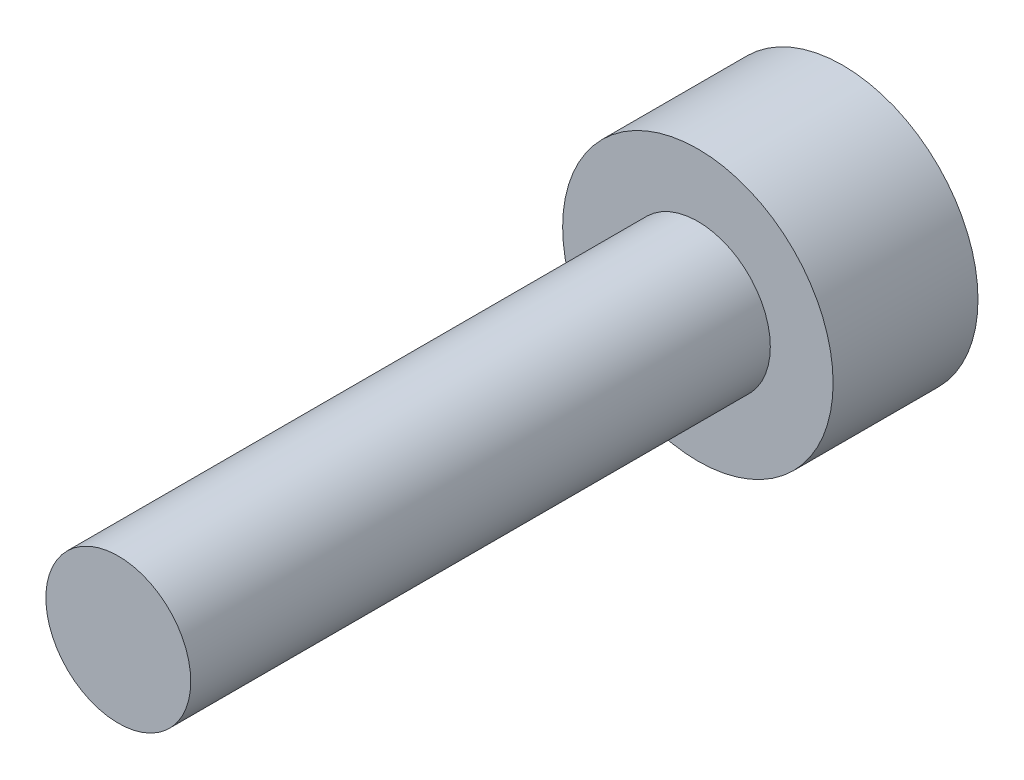
ISO-10303-21;
HEADER;
FILE_DESCRIPTION(('STEP AP214'),'2;1');
FILE_NAME('part.step','',(''),(''),'','','');
FILE_SCHEMA(('AUTOMOTIVE_DESIGN { 1 0 10303 214 1 1 1 1 }'));
ENDSEC;
DATA;
#1=APPLICATION_CONTEXT('core data for automotive mechanical design processes');
#2=APPLICATION_PROTOCOL_DEFINITION('international standard','automotive_design',2000,#1);
#3=PRODUCT_CONTEXT('',#1,'mechanical');
#4=PRODUCT('Part','Part','',(#3));
#5=PRODUCT_RELATED_PRODUCT_CATEGORY('part','',(#4));
#6=PRODUCT_DEFINITION_FORMATION('','',#4);
#7=PRODUCT_DEFINITION_CONTEXT('part definition',#1,'design');
#8=PRODUCT_DEFINITION('design','',#6,#7);
#9=PRODUCT_DEFINITION_SHAPE('','',#8);
#10=(LENGTH_UNIT() NAMED_UNIT(*) SI_UNIT(.MILLI.,.METRE.));
#11=(NAMED_UNIT(*) PLANE_ANGLE_UNIT() SI_UNIT($,.RADIAN.));
#12=(NAMED_UNIT(*) SI_UNIT($,.STERADIAN.) SOLID_ANGLE_UNIT());
#13=UNCERTAINTY_MEASURE_WITH_UNIT(LENGTH_MEASURE(1.E-05),#10,'distance_accuracy_value','');
#14=(GEOMETRIC_REPRESENTATION_CONTEXT(3) GLOBAL_UNCERTAINTY_ASSIGNED_CONTEXT((#13)) GLOBAL_UNIT_ASSIGNED_CONTEXT((#10,
#11,#12)) REPRESENTATION_CONTEXT('',''));
#15=CARTESIAN_POINT('',(0.,0.,0.));
#16=DIRECTION('',(0.,0.,1.));
#17=DIRECTION('',(1.,0.,0.));
#18=AXIS2_PLACEMENT_3D('',#15,#16,#17);
#19=CARTESIAN_POINT('',(0.,0.,-3.));
#20=DIRECTION('',(0.,0.,1.));
#21=DIRECTION('',(1.,0.,0.));
#22=AXIS2_PLACEMENT_3D('',#19,#20,#21);
#23=PLANE('',#22);
#24=CARTESIAN_POINT('',(0.,0.,-3.));
#25=DIRECTION('',(0.,0.,1.));
#26=DIRECTION('',(1.,0.,0.));
#27=AXIS2_PLACEMENT_3D('',#24,#25,#26);
#28=CIRCLE('',#27,2.8);
#29=CARTESIAN_POINT('',(2.8,0.,-3.));
#30=VERTEX_POINT('',#29);
#31=EDGE_CURVE('E112',#30,#30,#28,.T.);
#32=ORIENTED_EDGE('',*,*,#31,.F.);
#33=EDGE_LOOP('',(#32));
#34=FACE_BOUND('',#33,.T.);
#35=DIRECTION('',(0.,-1.,0.));
#36=VECTOR('',#35,1.);
#37=CARTESIAN_POINT('',(1.25,0.,-3.));
#38=LINE('',#37,#36);
#39=CARTESIAN_POINT('',(1.25,0.721687836487032,-3.));
#40=VERTEX_POINT('',#39);
#41=CARTESIAN_POINT('',(1.25,-0.721687836487033,-3.));
#42=VERTEX_POINT('',#41);
#43=EDGE_CURVE('E11',#40,#42,#38,.T.);
#44=ORIENTED_EDGE('',*,*,#43,.F.);
#45=DIRECTION('',(0.866025403784439,-0.5,0.));
#46=VECTOR('',#45,1.);
#47=CARTESIAN_POINT('',(0.625,1.08253175473055,-3.));
#48=LINE('',#47,#46);
#49=CARTESIAN_POINT('',(0.,1.44337567297406,-3.));
#50=VERTEX_POINT('',#49);
#51=EDGE_CURVE('E50',#50,#40,#48,.T.);
#52=ORIENTED_EDGE('',*,*,#51,.F.);
#53=DIRECTION('',(0.866025403784439,0.5,0.));
#54=VECTOR('',#53,1.);
#55=CARTESIAN_POINT('',(-0.625,1.08253175473055,-3.));
#56=LINE('',#55,#54);
#57=CARTESIAN_POINT('',(-1.25,0.721687836487032,-3.));
#58=VERTEX_POINT('',#57);
#59=EDGE_CURVE('E132',#58,#50,#56,.T.);
#60=ORIENTED_EDGE('',*,*,#59,.F.);
#61=DIRECTION('',(0.,1.,0.));
#62=VECTOR('',#61,1.);
#63=CARTESIAN_POINT('',(-1.25,0.,-3.));
#64=LINE('',#63,#62);
#65=CARTESIAN_POINT('',(-1.25,-0.721687836487032,-3.));
#66=VERTEX_POINT('',#65);
#67=EDGE_CURVE('E129',#66,#58,#64,.T.);
#68=ORIENTED_EDGE('',*,*,#67,.F.);
#69=DIRECTION('',(-0.866025403784439,0.5,0.));
#70=VECTOR('',#69,1.);
#71=CARTESIAN_POINT('',(-0.625,-1.08253175473055,-3.));
#72=LINE('',#71,#70);
#73=CARTESIAN_POINT('',(0.,-1.44337567297406,-3.));
#74=VERTEX_POINT('',#73);
#75=EDGE_CURVE('E130',#74,#66,#72,.T.);
#76=ORIENTED_EDGE('',*,*,#75,.F.);
#77=DIRECTION('',(-0.866025403784439,-0.5,0.));
#78=VECTOR('',#77,1.);
#79=CARTESIAN_POINT('',(0.624999999999999,-1.08253175473055,-3.));
#80=LINE('',#79,#78);
#81=EDGE_CURVE('E118',#42,#74,#80,.T.);
#82=ORIENTED_EDGE('',*,*,#81,.F.);
#83=EDGE_LOOP('',(#44,#52,#60,#68,#76,#82));
#84=FACE_BOUND('',#83,.T.);
#85=ADVANCED_FACE('F39',(#34,#84),#23,.F.);
#86=CARTESIAN_POINT('',(0.,0.,0.));
#87=DIRECTION('',(0.,0.,-1.));
#88=DIRECTION('',(-1.,0.,0.));
#89=AXIS2_PLACEMENT_3D('',#86,#87,#88);
#90=CYLINDRICAL_SURFACE('',#89,2.8);
#91=CARTESIAN_POINT('',(0.,0.,0.));
#92=DIRECTION('',(0.,0.,1.));
#93=DIRECTION('',(1.,0.,0.));
#94=AXIS2_PLACEMENT_3D('',#91,#92,#93);
#95=CIRCLE('',#94,2.8);
#96=CARTESIAN_POINT('',(2.8,0.,0.));
#97=VERTEX_POINT('',#96);
#98=EDGE_CURVE('E122',#97,#97,#95,.T.);
#99=ORIENTED_EDGE('',*,*,#98,.F.);
#100=EDGE_LOOP('',(#99));
#101=FACE_BOUND('',#100,.T.);
#102=ORIENTED_EDGE('',*,*,#31,.T.);
#103=EDGE_LOOP('',(#102));
#104=FACE_BOUND('',#103,.T.);
#105=ADVANCED_FACE('F41',(#101,#104),#90,.T.);
#106=CARTESIAN_POINT('',(0.,0.,0.));
#107=DIRECTION('',(0.,0.,1.));
#108=DIRECTION('',(1.,0.,0.));
#109=AXIS2_PLACEMENT_3D('',#106,#107,#108);
#110=PLANE('',#109);
#111=CARTESIAN_POINT('',(0.,0.,0.));
#112=DIRECTION('',(0.,0.,1.));
#113=DIRECTION('',(1.,0.,0.));
#114=AXIS2_PLACEMENT_3D('',#111,#112,#113);
#115=CIRCLE('',#114,1.5);
#116=CARTESIAN_POINT('',(1.5,0.,0.));
#117=VERTEX_POINT('',#116);
#118=EDGE_CURVE('E120',#117,#117,#115,.T.);
#119=ORIENTED_EDGE('',*,*,#118,.F.);
#120=EDGE_LOOP('',(#119));
#121=FACE_BOUND('',#120,.T.);
#122=ORIENTED_EDGE('',*,*,#98,.T.);
#123=EDGE_LOOP('',(#122));
#124=FACE_BOUND('',#123,.T.);
#125=ADVANCED_FACE('F179',(#121,#124),#110,.T.);
#126=CARTESIAN_POINT('',(0.,0.,12.));
#127=DIRECTION('',(0.,0.,-1.));
#128=DIRECTION('',(-1.,0.,0.));
#129=AXIS2_PLACEMENT_3D('',#126,#127,#128);
#130=CYLINDRICAL_SURFACE('',#129,1.5);
#131=CARTESIAN_POINT('',(0.,0.,12.));
#132=DIRECTION('',(0.,0.,1.));
#133=DIRECTION('',(1.,0.,0.));
#134=AXIS2_PLACEMENT_3D('',#131,#132,#133);
#135=CIRCLE('',#134,1.5);
#136=CARTESIAN_POINT('',(1.5,0.,12.));
#137=VERTEX_POINT('',#136);
#138=EDGE_CURVE('E110',#137,#137,#135,.T.);
#139=ORIENTED_EDGE('',*,*,#138,.F.);
#140=EDGE_LOOP('',(#139));
#141=FACE_BOUND('',#140,.T.);
#142=ORIENTED_EDGE('',*,*,#118,.T.);
#143=EDGE_LOOP('',(#142));
#144=FACE_BOUND('',#143,.T.);
#145=ADVANCED_FACE('F184',(#141,#144),#130,.T.);
#146=CARTESIAN_POINT('',(0.,0.,12.));
#147=DIRECTION('',(0.,0.,1.));
#148=DIRECTION('',(1.,0.,0.));
#149=AXIS2_PLACEMENT_3D('',#146,#147,#148);
#150=PLANE('',#149);
#151=ORIENTED_EDGE('',*,*,#138,.T.);
#152=EDGE_LOOP('',(#151));
#153=FACE_BOUND('',#152,.T.);
#154=ADVANCED_FACE('F189',(#153),#150,.T.);
#155=CARTESIAN_POINT('',(1.25,-0.721687836487033,-1.4));
#156=DIRECTION('',(-1.,0.,0.));
#157=DIRECTION('',(0.,-1.,0.));
#158=AXIS2_PLACEMENT_3D('',#155,#156,#157);
#159=PLANE('',#158);
#160=ORIENTED_EDGE('',*,*,#43,.T.);
#161=DIRECTION('',(0.,0.,-1.));
#162=VECTOR('',#161,1.);
#163=CARTESIAN_POINT('',(1.25,-0.721687836487033,-1.4));
#164=LINE('',#163,#162);
#165=CARTESIAN_POINT('',(1.25,-0.721687836487033,-1.4));
#166=VERTEX_POINT('',#165);
#167=EDGE_CURVE('E53',#166,#42,#164,.T.);
#168=ORIENTED_EDGE('',*,*,#167,.F.);
#169=DIRECTION('',(0.,1.,0.));
#170=VECTOR('',#169,1.);
#171=CARTESIAN_POINT('',(1.25,-0.721687836487033,-1.4));
#172=LINE('',#171,#170);
#173=CARTESIAN_POINT('',(1.25,0.721687836487032,-1.4));
#174=VERTEX_POINT('',#173);
#175=EDGE_CURVE('E96',#166,#174,#172,.T.);
#176=ORIENTED_EDGE('',*,*,#175,.T.);
#177=DIRECTION('',(0.,0.,-1.));
#178=VECTOR('',#177,1.);
#179=CARTESIAN_POINT('',(1.25,0.721687836487032,-1.4));
#180=LINE('',#179,#178);
#181=EDGE_CURVE('E103',#174,#40,#180,.T.);
#182=ORIENTED_EDGE('',*,*,#181,.T.);
#183=EDGE_LOOP('',(#160,#168,#176,#182));
#184=FACE_BOUND('',#183,.T.);
#185=ADVANCED_FACE('F105',(#184),#159,.T.);
#186=CARTESIAN_POINT('',(1.25,0.721687836487032,-1.4));
#187=DIRECTION('',(-0.5,-0.866025403784439,0.));
#188=DIRECTION('',(0.866025403784439,-0.5,0.));
#189=AXIS2_PLACEMENT_3D('',#186,#187,#188);
#190=PLANE('',#189);
#191=ORIENTED_EDGE('',*,*,#51,.T.);
#192=ORIENTED_EDGE('',*,*,#181,.F.);
#193=DIRECTION('',(-0.866025403784439,0.5,0.));
#194=VECTOR('',#193,1.);
#195=CARTESIAN_POINT('',(1.25,0.721687836487032,-1.4));
#196=LINE('',#195,#194);
#197=CARTESIAN_POINT('',(0.,1.44337567297406,-1.4));
#198=VERTEX_POINT('',#197);
#199=EDGE_CURVE('E95',#174,#198,#196,.T.);
#200=ORIENTED_EDGE('',*,*,#199,.T.);
#201=DIRECTION('',(0.,0.,-1.));
#202=VECTOR('',#201,1.);
#203=CARTESIAN_POINT('',(0.,1.44337567297406,-1.4));
#204=LINE('',#203,#202);
#205=EDGE_CURVE('E107',#198,#50,#204,.T.);
#206=ORIENTED_EDGE('',*,*,#205,.T.);
#207=EDGE_LOOP('',(#191,#192,#200,#206));
#208=FACE_BOUND('',#207,.T.);
#209=ADVANCED_FACE('F106',(#208),#190,.T.);
#210=CARTESIAN_POINT('',(0.,1.44337567297406,-1.4));
#211=DIRECTION('',(0.5,-0.866025403784439,0.));
#212=DIRECTION('',(0.866025403784439,0.5,0.));
#213=AXIS2_PLACEMENT_3D('',#210,#211,#212);
#214=PLANE('',#213);
#215=ORIENTED_EDGE('',*,*,#59,.T.);
#216=ORIENTED_EDGE('',*,*,#205,.F.);
#217=DIRECTION('',(-0.866025403784439,-0.5,0.));
#218=VECTOR('',#217,1.);
#219=CARTESIAN_POINT('',(0.,1.44337567297406,-1.4));
#220=LINE('',#219,#218);
#221=CARTESIAN_POINT('',(-1.25,0.721687836487032,-1.4));
#222=VERTEX_POINT('',#221);
#223=EDGE_CURVE('E98',#198,#222,#220,.T.);
#224=ORIENTED_EDGE('',*,*,#223,.T.);
#225=DIRECTION('',(0.,0.,-1.));
#226=VECTOR('',#225,1.);
#227=CARTESIAN_POINT('',(-1.25,0.721687836487032,-1.4));
#228=LINE('',#227,#226);
#229=EDGE_CURVE('E114',#222,#58,#228,.T.);
#230=ORIENTED_EDGE('',*,*,#229,.T.);
#231=EDGE_LOOP('',(#215,#216,#224,#230));
#232=FACE_BOUND('',#231,.T.);
#233=ADVANCED_FACE('F133',(#232),#214,.T.);
#234=CARTESIAN_POINT('',(-1.25,0.721687836487032,-1.4));
#235=DIRECTION('',(1.,0.,0.));
#236=DIRECTION('',(0.,1.,0.));
#237=AXIS2_PLACEMENT_3D('',#234,#235,#236);
#238=PLANE('',#237);
#239=ORIENTED_EDGE('',*,*,#67,.T.);
#240=ORIENTED_EDGE('',*,*,#229,.F.);
#241=DIRECTION('',(0.,-1.,0.));
#242=VECTOR('',#241,1.);
#243=CARTESIAN_POINT('',(-1.25,0.721687836487032,-1.4));
#244=LINE('',#243,#242);
#245=CARTESIAN_POINT('',(-1.25,-0.721687836487032,-1.4));
#246=VERTEX_POINT('',#245);
#247=EDGE_CURVE('E157',#222,#246,#244,.T.);
#248=ORIENTED_EDGE('',*,*,#247,.T.);
#249=DIRECTION('',(0.,0.,-1.));
#250=VECTOR('',#249,1.);
#251=CARTESIAN_POINT('',(-1.25,-0.721687836487032,-1.4));
#252=LINE('',#251,#250);
#253=EDGE_CURVE('E151',#246,#66,#252,.T.);
#254=ORIENTED_EDGE('',*,*,#253,.T.);
#255=EDGE_LOOP('',(#239,#240,#248,#254));
#256=FACE_BOUND('',#255,.T.);
#257=ADVANCED_FACE('F165',(#256),#238,.T.);
#258=CARTESIAN_POINT('',(-1.25,-0.721687836487032,-1.4));
#259=DIRECTION('',(0.5,0.866025403784439,0.));
#260=DIRECTION('',(-0.866025403784439,0.5,0.));
#261=AXIS2_PLACEMENT_3D('',#258,#259,#260);
#262=PLANE('',#261);
#263=ORIENTED_EDGE('',*,*,#75,.T.);
#264=ORIENTED_EDGE('',*,*,#253,.F.);
#265=DIRECTION('',(0.866025403784439,-0.5,0.));
#266=VECTOR('',#265,1.);
#267=CARTESIAN_POINT('',(-1.25,-0.721687836487032,-1.4));
#268=LINE('',#267,#266);
#269=CARTESIAN_POINT('',(0.,-1.44337567297406,-1.4));
#270=VERTEX_POINT('',#269);
#271=EDGE_CURVE('E147',#246,#270,#268,.T.);
#272=ORIENTED_EDGE('',*,*,#271,.T.);
#273=DIRECTION('',(0.,0.,-1.));
#274=VECTOR('',#273,1.);
#275=CARTESIAN_POINT('',(0.,-1.44337567297406,-1.4));
#276=LINE('',#275,#274);
#277=EDGE_CURVE('E145',#270,#74,#276,.T.);
#278=ORIENTED_EDGE('',*,*,#277,.T.);
#279=EDGE_LOOP('',(#263,#264,#272,#278));
#280=FACE_BOUND('',#279,.T.);
#281=ADVANCED_FACE('F148',(#280),#262,.T.);
#282=CARTESIAN_POINT('',(0.,-1.44337567297406,-1.4));
#283=DIRECTION('',(-0.5,0.866025403784439,0.));
#284=DIRECTION('',(-0.866025403784439,-0.5,0.));
#285=AXIS2_PLACEMENT_3D('',#282,#283,#284);
#286=PLANE('',#285);
#287=ORIENTED_EDGE('',*,*,#81,.T.);
#288=ORIENTED_EDGE('',*,*,#277,.F.);
#289=DIRECTION('',(0.866025403784439,0.5,0.));
#290=VECTOR('',#289,1.);
#291=CARTESIAN_POINT('',(0.,-1.44337567297406,-1.4));
#292=LINE('',#291,#290);
#293=EDGE_CURVE('E152',#270,#166,#292,.T.);
#294=ORIENTED_EDGE('',*,*,#293,.T.);
#295=ORIENTED_EDGE('',*,*,#167,.T.);
#296=EDGE_LOOP('',(#287,#288,#294,#295));
#297=FACE_BOUND('',#296,.T.);
#298=ADVANCED_FACE('F141',(#297),#286,.T.);
#299=CARTESIAN_POINT('',(0.,0.,-1.4));
#300=DIRECTION('',(0.,0.,1.));
#301=DIRECTION('',(1.,0.,0.));
#302=AXIS2_PLACEMENT_3D('',#299,#300,#301);
#303=PLANE('',#302);
#304=ORIENTED_EDGE('',*,*,#175,.F.);
#305=ORIENTED_EDGE('',*,*,#293,.F.);
#306=ORIENTED_EDGE('',*,*,#271,.F.);
#307=ORIENTED_EDGE('',*,*,#247,.F.);
#308=ORIENTED_EDGE('',*,*,#223,.F.);
#309=ORIENTED_EDGE('',*,*,#199,.F.);
#310=EDGE_LOOP('',(#304,#305,#306,#307,#308,#309));
#311=FACE_BOUND('',#310,.T.);
#312=ADVANCED_FACE('F94',(#311),#303,.F.);
#313=CLOSED_SHELL('',(#85,#105,#125,#145,#154,#185,#209,#233,#257,#281,#298,#312));
#314=MANIFOLD_SOLID_BREP('B2',#313);
#315=ADVANCED_BREP_SHAPE_REPRESENTATION('',(#18,#314),#14);
#316=SHAPE_DEFINITION_REPRESENTATION(#9,#315);
ENDSEC;
END-ISO-10303-21;
